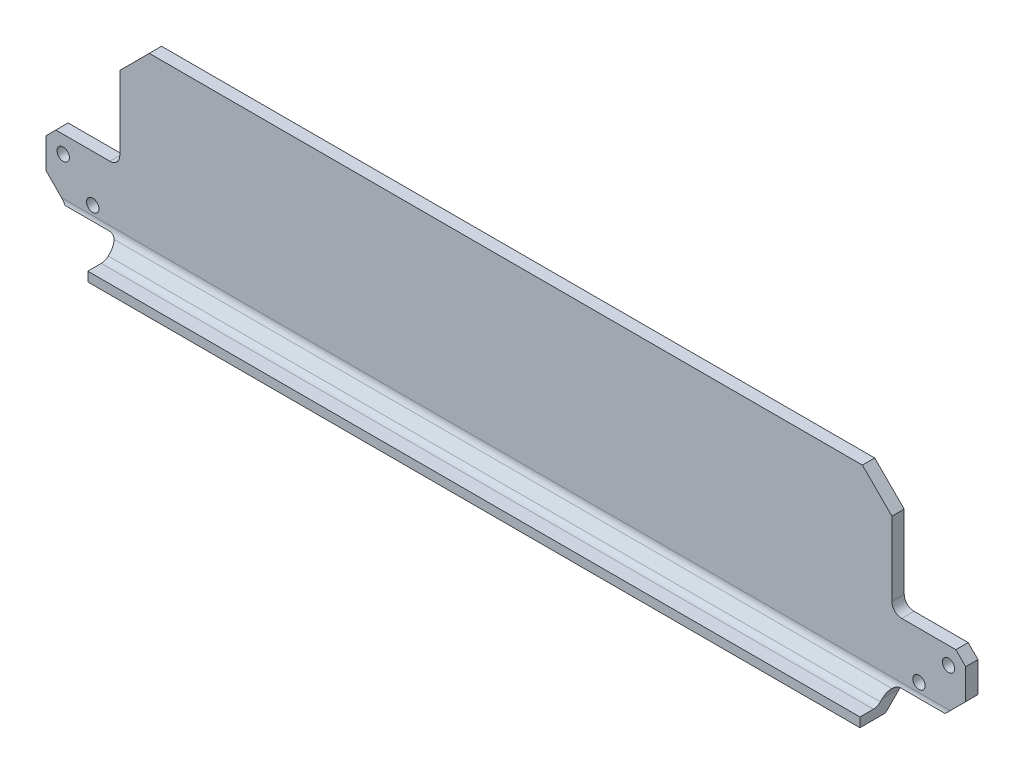
ISO-10303-21;
HEADER;
FILE_DESCRIPTION(('STEP AP214'),'2;1');
FILE_NAME('part.step','',(''),(''),'','','');
FILE_SCHEMA(('AUTOMOTIVE_DESIGN { 1 0 10303 214 1 1 1 1 }'));
ENDSEC;
DATA;
#1=APPLICATION_CONTEXT('core data for automotive mechanical design processes');
#2=APPLICATION_PROTOCOL_DEFINITION('international standard','automotive_design',2000,#1);
#3=PRODUCT_CONTEXT('',#1,'mechanical');
#4=PRODUCT('Part','Part','',(#3));
#5=PRODUCT_RELATED_PRODUCT_CATEGORY('part','',(#4));
#6=PRODUCT_DEFINITION_FORMATION('','',#4);
#7=PRODUCT_DEFINITION_CONTEXT('part definition',#1,'design');
#8=PRODUCT_DEFINITION('design','',#6,#7);
#9=PRODUCT_DEFINITION_SHAPE('','',#8);
#10=(LENGTH_UNIT() NAMED_UNIT(*) SI_UNIT(.MILLI.,.METRE.));
#11=(NAMED_UNIT(*) PLANE_ANGLE_UNIT() SI_UNIT($,.RADIAN.));
#12=(NAMED_UNIT(*) SI_UNIT($,.STERADIAN.) SOLID_ANGLE_UNIT());
#13=UNCERTAINTY_MEASURE_WITH_UNIT(LENGTH_MEASURE(1.E-05),#10,'distance_accuracy_value','');
#14=(GEOMETRIC_REPRESENTATION_CONTEXT(3) GLOBAL_UNCERTAINTY_ASSIGNED_CONTEXT((#13)) GLOBAL_UNIT_ASSIGNED_CONTEXT((#10,
#11,#12)) REPRESENTATION_CONTEXT('',''));
#15=CARTESIAN_POINT('',(0.,0.,0.));
#16=DIRECTION('',(0.,0.,1.));
#17=DIRECTION('',(1.,0.,0.));
#18=AXIS2_PLACEMENT_3D('',#15,#16,#17);
#19=CARTESIAN_POINT('',(99.695,0.,0.));
#20=DIRECTION('',(1.,0.,0.));
#21=DIRECTION('',(0.,0.,-1.));
#22=AXIS2_PLACEMENT_3D('',#19,#20,#21);
#23=PLANE('',#22);
#24=DIRECTION('',(0.,-1.,0.));
#25=VECTOR('',#24,1.);
#26=CARTESIAN_POINT('',(99.695,50.8,3.17500000000001));
#27=LINE('',#26,#25);
#28=CARTESIAN_POINT('',(99.695,43.18,3.17500000000001));
#29=VERTEX_POINT('',#28);
#30=CARTESIAN_POINT('',(99.695,24.130000000049,3.17500000000001));
#31=VERTEX_POINT('',#30);
#32=EDGE_CURVE('E611',#29,#31,#27,.T.);
#33=ORIENTED_EDGE('',*,*,#32,.T.);
#34=DIRECTION('',(0.,0.,-1.));
#35=VECTOR('',#34,1.);
#36=CARTESIAN_POINT('',(99.695,24.130000000049,0.));
#37=LINE('',#36,#35);
#38=CARTESIAN_POINT('',(99.695,24.130000000049,0.));
#39=VERTEX_POINT('',#38);
#40=EDGE_CURVE('E368',#31,#39,#37,.T.);
#41=ORIENTED_EDGE('',*,*,#40,.T.);
#42=DIRECTION('',(0.,1.,0.));
#43=VECTOR('',#42,1.);
#44=CARTESIAN_POINT('',(99.695,4.826,0.));
#45=LINE('',#44,#43);
#46=CARTESIAN_POINT('',(99.695,43.18,0.));
#47=VERTEX_POINT('',#46);
#48=EDGE_CURVE('E566',#39,#47,#45,.T.);
#49=ORIENTED_EDGE('',*,*,#48,.T.);
#50=DIRECTION('',(0.,0.,1.));
#51=VECTOR('',#50,1.);
#52=CARTESIAN_POINT('',(99.695,43.18,3.17500000000001));
#53=LINE('',#52,#51);
#54=EDGE_CURVE('E328',#47,#29,#53,.T.);
#55=ORIENTED_EDGE('',*,*,#54,.T.);
#56=EDGE_LOOP('',(#33,#41,#49,#55));
#57=FACE_BOUND('',#56,.T.);
#58=ADVANCED_FACE('F47',(#57),#23,.T.);
#59=CARTESIAN_POINT('',(-99.695,0.,0.));
#60=DIRECTION('',(1.,0.,0.));
#61=DIRECTION('',(0.,0.,-1.));
#62=AXIS2_PLACEMENT_3D('',#59,#60,#61);
#63=PLANE('',#62);
#64=DIRECTION('',(0.,1.,0.));
#65=VECTOR('',#64,1.);
#66=CARTESIAN_POINT('',(-99.695,4.826,0.));
#67=LINE('',#66,#65);
#68=CARTESIAN_POINT('',(-99.695,24.130000000049,0.));
#69=VERTEX_POINT('',#68);
#70=CARTESIAN_POINT('',(-99.695,43.18,0.));
#71=VERTEX_POINT('',#70);
#72=EDGE_CURVE('E592',#69,#71,#67,.T.);
#73=ORIENTED_EDGE('',*,*,#72,.F.);
#74=DIRECTION('',(0.,0.,-1.));
#75=VECTOR('',#74,1.);
#76=CARTESIAN_POINT('',(-99.695,24.130000000049,3.17500000000001));
#77=LINE('',#76,#75);
#78=CARTESIAN_POINT('',(-99.695,24.130000000049,3.17500000000001));
#79=VERTEX_POINT('',#78);
#80=EDGE_CURVE('E379',#69,#79,#77,.F.);
#81=ORIENTED_EDGE('',*,*,#80,.T.);
#82=DIRECTION('',(0.,-1.,0.));
#83=VECTOR('',#82,1.);
#84=CARTESIAN_POINT('',(-99.695,50.8,3.17500000000001));
#85=LINE('',#84,#83);
#86=CARTESIAN_POINT('',(-99.695,43.18,3.17500000000001));
#87=VERTEX_POINT('',#86);
#88=EDGE_CURVE('E588',#87,#79,#85,.T.);
#89=ORIENTED_EDGE('',*,*,#88,.F.);
#90=DIRECTION('',(0.,0.,-1.));
#91=VECTOR('',#90,1.);
#92=CARTESIAN_POINT('',(-99.695,43.18,0.));
#93=LINE('',#92,#91);
#94=EDGE_CURVE('E352',#87,#71,#93,.T.);
#95=ORIENTED_EDGE('',*,*,#94,.T.);
#96=EDGE_LOOP('',(#73,#81,#89,#95));
#97=FACE_BOUND('',#96,.T.);
#98=ADVANCED_FACE('F474',(#97),#63,.F.);
#99=CARTESIAN_POINT('',(99.695,2.413,11.43));
#100=DIRECTION('',(0.,0.,-1.));
#101=DIRECTION('',(-1.,0.,0.));
#102=AXIS2_PLACEMENT_3D('',#99,#100,#101);
#103=PLANE('',#102);
#104=DIRECTION('',(0.,-1.,0.));
#105=VECTOR('',#104,1.);
#106=CARTESIAN_POINT('',(-99.695,2.413,11.43));
#107=LINE('',#106,#105);
#108=CARTESIAN_POINT('',(-99.695,2.413,11.43));
#109=VERTEX_POINT('',#108);
#110=CARTESIAN_POINT('',(-99.695,0.,11.43));
#111=VERTEX_POINT('',#110);
#112=EDGE_CURVE('E266',#109,#111,#107,.T.);
#113=ORIENTED_EDGE('',*,*,#112,.T.);
#114=DIRECTION('',(-1.,0.,0.));
#115=VECTOR('',#114,1.);
#116=CARTESIAN_POINT('',(99.695,0.,11.43));
#117=LINE('',#116,#115);
#118=CARTESIAN_POINT('',(99.695,0.,11.43));
#119=VERTEX_POINT('',#118);
#120=EDGE_CURVE('E243',#119,#111,#117,.T.);
#121=ORIENTED_EDGE('',*,*,#120,.F.);
#122=DIRECTION('',(0.,-1.,0.));
#123=VECTOR('',#122,1.);
#124=CARTESIAN_POINT('',(99.695,2.413,11.43));
#125=LINE('',#124,#123);
#126=CARTESIAN_POINT('',(99.695,2.413,11.43));
#127=VERTEX_POINT('',#126);
#128=EDGE_CURVE('E252',#127,#119,#125,.T.);
#129=ORIENTED_EDGE('',*,*,#128,.F.);
#130=DIRECTION('',(-1.,0.,0.));
#131=VECTOR('',#130,1.);
#132=CARTESIAN_POINT('',(99.695,2.413,11.43));
#133=LINE('',#132,#131);
#134=EDGE_CURVE('E577',#127,#109,#133,.T.);
#135=ORIENTED_EDGE('',*,*,#134,.T.);
#136=EDGE_LOOP('',(#113,#121,#129,#135));
#137=FACE_BOUND('',#136,.T.);
#138=ADVANCED_FACE('F264',(#137),#103,.F.);
#139=CARTESIAN_POINT('',(99.695,0.,11.43));
#140=DIRECTION('',(0.,1.,0.));
#141=DIRECTION('',(0.,0.,1.));
#142=AXIS2_PLACEMENT_3D('',#139,#140,#141);
#143=PLANE('',#142);
#144=DIRECTION('',(0.,0.,-1.));
#145=VECTOR('',#144,1.);
#146=CARTESIAN_POINT('',(-99.695,0.,11.43));
#147=LINE('',#146,#145);
#148=CARTESIAN_POINT('',(-99.695,0.,4.82600000000001));
#149=VERTEX_POINT('',#148);
#150=EDGE_CURVE('E599',#111,#149,#147,.T.);
#151=ORIENTED_EDGE('',*,*,#150,.T.);
#152=DIRECTION('',(-1.,0.,0.));
#153=VECTOR('',#152,1.);
#154=CARTESIAN_POINT('',(99.695,0.,4.82600000000001));
#155=LINE('',#154,#153);
#156=CARTESIAN_POINT('',(99.695,0.,4.82600000000001));
#157=VERTEX_POINT('',#156);
#158=EDGE_CURVE('E246',#157,#149,#155,.T.);
#159=ORIENTED_EDGE('',*,*,#158,.F.);
#160=DIRECTION('',(0.,0.,-1.));
#161=VECTOR('',#160,1.);
#162=CARTESIAN_POINT('',(99.695,0.,11.43));
#163=LINE('',#162,#161);
#164=EDGE_CURVE('E239',#119,#157,#163,.T.);
#165=ORIENTED_EDGE('',*,*,#164,.F.);
#166=ORIENTED_EDGE('',*,*,#120,.T.);
#167=EDGE_LOOP('',(#151,#159,#165,#166));
#168=FACE_BOUND('',#167,.T.);
#169=ADVANCED_FACE('F241',(#168),#143,.F.);
#170=CARTESIAN_POINT('',(99.695,0.,4.82600000000001));
#171=DIRECTION('',(0.,0.707106781186549,0.707106781186546));
#172=DIRECTION('',(0.,-0.707106781186546,0.707106781186549));
#173=AXIS2_PLACEMENT_3D('',#170,#171,#172);
#174=PLANE('',#173);
#175=DIRECTION('',(0.,0.707106781186546,-0.707106781186549));
#176=VECTOR('',#175,1.);
#177=CARTESIAN_POINT('',(-99.695,0.,4.82600000000001));
#178=LINE('',#177,#176);
#179=CARTESIAN_POINT('',(-99.695,3.60112806053457,1.22487193946543));
#180=VERTEX_POINT('',#179);
#181=EDGE_CURVE('E595',#149,#180,#178,.T.);
#182=ORIENTED_EDGE('',*,*,#181,.T.);
#183=CARTESIAN_POINT('',(-102.235,3.60112806053457,1.22487193946543));
#184=DIRECTION('',(0.,0.707106781186549,0.707106781186546));
#185=DIRECTION('',(0.,-0.707106781186546,0.707106781186549));
#186=AXIS2_PLACEMENT_3D('',#183,#184,#185);
#187=ELLIPSE('',#186,3.59210244842767,2.54);
#188=CARTESIAN_POINT('',(-100.009850851761,4.826,0.));
#189=VERTEX_POINT('',#188);
#190=EDGE_CURVE('E382',#180,#189,#187,.T.);
#191=ORIENTED_EDGE('',*,*,#190,.T.);
#192=DIRECTION('',(-1.,0.,0.));
#193=VECTOR('',#192,1.);
#194=CARTESIAN_POINT('',(99.695,4.826,0.));
#195=LINE('',#194,#193);
#196=CARTESIAN_POINT('',(100.009850851761,4.826,0.));
#197=VERTEX_POINT('',#196);
#198=EDGE_CURVE('E275',#197,#189,#195,.T.);
#199=ORIENTED_EDGE('',*,*,#198,.F.);
#200=CARTESIAN_POINT('',(102.235,3.60112806053457,1.22487193946543));
#201=DIRECTION('',(0.,0.707106781186549,0.707106781186546));
#202=DIRECTION('',(0.,-0.707106781186546,0.707106781186549));
#203=AXIS2_PLACEMENT_3D('',#200,#201,#202);
#204=ELLIPSE('',#203,3.59210244842767,2.54);
#205=CARTESIAN_POINT('',(99.695,3.60112806053457,1.22487193946543));
#206=VERTEX_POINT('',#205);
#207=EDGE_CURVE('E396',#197,#206,#204,.T.);
#208=ORIENTED_EDGE('',*,*,#207,.T.);
#209=DIRECTION('',(0.,0.707106781186546,-0.707106781186549));
#210=VECTOR('',#209,1.);
#211=CARTESIAN_POINT('',(99.695,0.,4.82600000000001));
#212=LINE('',#211,#210);
#213=EDGE_CURVE('E251',#157,#206,#212,.T.);
#214=ORIENTED_EDGE('',*,*,#213,.F.);
#215=ORIENTED_EDGE('',*,*,#158,.T.);
#216=EDGE_LOOP('',(#182,#191,#199,#208,#214,#215));
#217=FACE_BOUND('',#216,.T.);
#218=ADVANCED_FACE('F514',(#217),#174,.F.);
#219=CARTESIAN_POINT('',(99.695,4.826,0.));
#220=DIRECTION('',(0.,0.,1.));
#221=DIRECTION('',(0.,-1.,0.));
#222=AXIS2_PLACEMENT_3D('',#219,#220,#221);
#223=PLANE('',#222);
#224=DIRECTION('',(-1.,0.,0.));
#225=VECTOR('',#224,1.);
#226=CARTESIAN_POINT('',(99.695,50.8,0.));
#227=LINE('',#226,#225);
#228=CARTESIAN_POINT('',(92.0749999999999,50.8,0.));
#229=VERTEX_POINT('',#228);
#230=CARTESIAN_POINT('',(-92.075,50.8,0.));
#231=VERTEX_POINT('',#230);
#232=EDGE_CURVE('E568',#229,#231,#227,.T.);
#233=ORIENTED_EDGE('',*,*,#232,.F.);
#234=DIRECTION('',(0.707106781186549,-0.707106781186546,0.));
#235=VECTOR('',#234,1.);
#236=CARTESIAN_POINT('',(99.695,43.18,0.));
#237=LINE('',#236,#235);
#238=EDGE_CURVE('E348',#229,#47,#237,.T.);
#239=ORIENTED_EDGE('',*,*,#238,.T.);
#240=ORIENTED_EDGE('',*,*,#48,.F.);
#241=CARTESIAN_POINT('',(102.235,24.130000000049,0.));
#242=DIRECTION('',(0.,0.,1.));
#243=DIRECTION('',(0.,-1.,0.));
#244=AXIS2_PLACEMENT_3D('',#241,#242,#243);
#245=CIRCLE('',#244,2.54);
#246=CARTESIAN_POINT('',(102.235,21.590000000049,0.));
#247=VERTEX_POINT('',#246);
#248=EDGE_CURVE('E403',#39,#247,#245,.T.);
#249=ORIENTED_EDGE('',*,*,#248,.T.);
#250=DIRECTION('',(1.,0.,0.));
#251=VECTOR('',#250,1.);
#252=CARTESIAN_POINT('',(99.695,21.590000000049,0.));
#253=LINE('',#252,#251);
#254=CARTESIAN_POINT('',(116.205,21.590000000049,0.));
#255=VERTEX_POINT('',#254);
#256=EDGE_CURVE('E657',#247,#255,#253,.T.);
#257=ORIENTED_EDGE('',*,*,#256,.T.);
#258=DIRECTION('',(-0.707106781186548,0.707106781186548,0.));
#259=VECTOR('',#258,1.);
#260=CARTESIAN_POINT('',(116.205,21.590000000049,0.));
#261=LINE('',#260,#259);
#262=CARTESIAN_POINT('',(118.745,19.0500000000489,0.));
#263=VERTEX_POINT('',#262);
#264=EDGE_CURVE('E309',#255,#263,#261,.F.);
#265=ORIENTED_EDGE('',*,*,#264,.T.);
#266=DIRECTION('',(0.,-1.,0.));
#267=VECTOR('',#266,1.);
#268=CARTESIAN_POINT('',(118.745,21.590000000049,0.));
#269=LINE('',#268,#267);
#270=CARTESIAN_POINT('',(118.745,11.2211280605346,0.));
#271=VERTEX_POINT('',#270);
#272=EDGE_CURVE('E661',#263,#271,#269,.T.);
#273=ORIENTED_EDGE('',*,*,#272,.T.);
#274=DIRECTION('',(0.707106781186548,0.707106781186548,0.));
#275=VECTOR('',#274,1.);
#276=CARTESIAN_POINT('',(118.745,11.2211280605346,0.));
#277=LINE('',#276,#275);
#278=CARTESIAN_POINT('',(113.665,6.14112806053457,0.));
#279=VERTEX_POINT('',#278);
#280=EDGE_CURVE('E282',#271,#279,#277,.F.);
#281=ORIENTED_EDGE('',*,*,#280,.T.);
#282=DIRECTION('',(-1.,0.,0.));
#283=VECTOR('',#282,1.);
#284=CARTESIAN_POINT('',(118.745,6.14112806053457,0.));
#285=LINE('',#284,#283);
#286=CARTESIAN_POINT('',(102.235,6.14112806053457,0.));
#287=VERTEX_POINT('',#286);
#288=EDGE_CURVE('E664',#279,#287,#285,.T.);
#289=ORIENTED_EDGE('',*,*,#288,.T.);
#290=CARTESIAN_POINT('',(102.235,3.60112806053457,0.));
#291=DIRECTION('',(0.,0.,1.));
#292=DIRECTION('',(0.,-1.,0.));
#293=AXIS2_PLACEMENT_3D('',#290,#291,#292);
#294=CIRCLE('',#293,2.54);
#295=EDGE_CURVE('E392',#287,#197,#294,.T.);
#296=ORIENTED_EDGE('',*,*,#295,.T.);
#297=ORIENTED_EDGE('',*,*,#198,.T.);
#298=CARTESIAN_POINT('',(-102.235,3.60112806053457,0.));
#299=DIRECTION('',(0.,0.,1.));
#300=DIRECTION('',(0.,-1.,0.));
#301=AXIS2_PLACEMENT_3D('',#298,#299,#300);
#302=CIRCLE('',#301,2.54);
#303=CARTESIAN_POINT('',(-102.235,6.14112806053457,0.));
#304=VERTEX_POINT('',#303);
#305=EDGE_CURVE('E386',#189,#304,#302,.T.);
#306=ORIENTED_EDGE('',*,*,#305,.T.);
#307=DIRECTION('',(1.,0.,0.));
#308=VECTOR('',#307,1.);
#309=CARTESIAN_POINT('',(-118.745,6.14112806053457,0.));
#310=LINE('',#309,#308);
#311=CARTESIAN_POINT('',(-113.665,6.14112806053457,0.));
#312=VERTEX_POINT('',#311);
#313=EDGE_CURVE('E622',#312,#304,#310,.T.);
#314=ORIENTED_EDGE('',*,*,#313,.F.);
#315=DIRECTION('',(0.707106781186546,-0.707106781186549,0.));
#316=VECTOR('',#315,1.);
#317=CARTESIAN_POINT('',(-113.665,6.14112806053457,0.));
#318=LINE('',#317,#316);
#319=CARTESIAN_POINT('',(-118.745,11.2211280605346,0.));
#320=VERTEX_POINT('',#319);
#321=EDGE_CURVE('E273',#312,#320,#318,.F.);
#322=ORIENTED_EDGE('',*,*,#321,.T.);
#323=DIRECTION('',(0.,-1.,0.));
#324=VECTOR('',#323,1.);
#325=CARTESIAN_POINT('',(-118.745,21.590000000049,0.));
#326=LINE('',#325,#324);
#327=CARTESIAN_POINT('',(-118.745,19.050000000049,0.));
#328=VERTEX_POINT('',#327);
#329=EDGE_CURVE('E630',#328,#320,#326,.T.);
#330=ORIENTED_EDGE('',*,*,#329,.F.);
#331=DIRECTION('',(-0.707106781186551,-0.707106781186544,0.));
#332=VECTOR('',#331,1.);
#333=CARTESIAN_POINT('',(-118.745,19.050000000049,0.));
#334=LINE('',#333,#332);
#335=CARTESIAN_POINT('',(-116.205,21.590000000049,0.));
#336=VERTEX_POINT('',#335);
#337=EDGE_CURVE('E305',#328,#336,#334,.F.);
#338=ORIENTED_EDGE('',*,*,#337,.T.);
#339=DIRECTION('',(-1.,0.,0.));
#340=VECTOR('',#339,1.);
#341=CARTESIAN_POINT('',(-99.695,21.590000000049,0.));
#342=LINE('',#341,#340);
#343=CARTESIAN_POINT('',(-102.235,21.590000000049,0.));
#344=VERTEX_POINT('',#343);
#345=EDGE_CURVE('E631',#344,#336,#342,.T.);
#346=ORIENTED_EDGE('',*,*,#345,.F.);
#347=CARTESIAN_POINT('',(-102.235,24.130000000049,0.));
#348=DIRECTION('',(0.,0.,1.));
#349=DIRECTION('',(0.,-1.,0.));
#350=AXIS2_PLACEMENT_3D('',#347,#348,#349);
#351=CIRCLE('',#350,2.54);
#352=EDGE_CURVE('E409',#344,#69,#351,.T.);
#353=ORIENTED_EDGE('',*,*,#352,.T.);
#354=ORIENTED_EDGE('',*,*,#72,.T.);
#355=DIRECTION('',(-0.707106781186546,-0.707106781186549,0.));
#356=VECTOR('',#355,1.);
#357=CARTESIAN_POINT('',(-92.075,50.8,0.));
#358=LINE('',#357,#356);
#359=EDGE_CURVE('E345',#71,#231,#358,.F.);
#360=ORIENTED_EDGE('',*,*,#359,.T.);
#361=EDGE_LOOP('',(#233,#239,#240,#249,#257,#265,#273,#281,#289,#296,#297,#306,#314,#322,#330,
#338,#346,#353,#354,#360));
#362=FACE_BOUND('',#361,.T.);
#363=CARTESIAN_POINT('',(-114.3,17.145,0.));
#364=DIRECTION('',(0.,0.,1.));
#365=DIRECTION('',(1.,0.,0.));
#366=AXIS2_PLACEMENT_3D('',#363,#364,#365);
#367=CIRCLE('',#366,1.6002);
#368=CARTESIAN_POINT('',(-112.6998,17.145,0.));
#369=VERTEX_POINT('',#368);
#370=EDGE_CURVE('E640',#369,#369,#367,.T.);
#371=ORIENTED_EDGE('',*,*,#370,.T.);
#372=EDGE_LOOP('',(#371));
#373=FACE_BOUND('',#372,.T.);
#374=CARTESIAN_POINT('',(-106.68,9.525,0.));
#375=DIRECTION('',(0.,0.,1.));
#376=DIRECTION('',(1.,0.,0.));
#377=AXIS2_PLACEMENT_3D('',#374,#375,#376);
#378=CIRCLE('',#377,1.6002);
#379=CARTESIAN_POINT('',(-105.0798,9.525,0.));
#380=VERTEX_POINT('',#379);
#381=EDGE_CURVE('E636',#380,#380,#378,.T.);
#382=ORIENTED_EDGE('',*,*,#381,.T.);
#383=EDGE_LOOP('',(#382));
#384=FACE_BOUND('',#383,.T.);
#385=CARTESIAN_POINT('',(106.68,9.525,0.));
#386=DIRECTION('',(0.,0.,-1.));
#387=DIRECTION('',(-1.,0.,0.));
#388=AXIS2_PLACEMENT_3D('',#385,#386,#387);
#389=CIRCLE('',#388,1.6002);
#390=CARTESIAN_POINT('',(105.0798,9.525,0.));
#391=VERTEX_POINT('',#390);
#392=EDGE_CURVE('E672',#391,#391,#389,.T.);
#393=ORIENTED_EDGE('',*,*,#392,.F.);
#394=EDGE_LOOP('',(#393));
#395=FACE_BOUND('',#394,.T.);
#396=CARTESIAN_POINT('',(114.3,17.145,0.));
#397=DIRECTION('',(0.,0.,-1.));
#398=DIRECTION('',(-1.,0.,0.));
#399=AXIS2_PLACEMENT_3D('',#396,#397,#398);
#400=CIRCLE('',#399,1.6002);
#401=CARTESIAN_POINT('',(112.6998,17.145,0.));
#402=VERTEX_POINT('',#401);
#403=EDGE_CURVE('E668',#402,#402,#400,.T.);
#404=ORIENTED_EDGE('',*,*,#403,.F.);
#405=EDGE_LOOP('',(#404));
#406=FACE_BOUND('',#405,.T.);
#407=ADVANCED_FACE('F510',(#362,#373,#384,#395,#406),#223,.F.);
#408=CARTESIAN_POINT('',(99.695,50.8,0.));
#409=DIRECTION('',(0.,-1.,0.));
#410=DIRECTION('',(0.,0.,-1.));
#411=AXIS2_PLACEMENT_3D('',#408,#409,#410);
#412=PLANE('',#411);
#413=DIRECTION('',(-1.,0.,0.));
#414=VECTOR('',#413,1.);
#415=CARTESIAN_POINT('',(99.695,50.8,3.17500000000001));
#416=LINE('',#415,#414);
#417=CARTESIAN_POINT('',(92.0749999999999,50.8,3.17500000000001));
#418=VERTEX_POINT('',#417);
#419=CARTESIAN_POINT('',(-92.075,50.8,3.17500000000001));
#420=VERTEX_POINT('',#419);
#421=EDGE_CURVE('E572',#418,#420,#416,.T.);
#422=ORIENTED_EDGE('',*,*,#421,.F.);
#423=DIRECTION('',(0.,0.,-1.));
#424=VECTOR('',#423,1.);
#425=CARTESIAN_POINT('',(92.0749999999999,50.8,0.));
#426=LINE('',#425,#424);
#427=EDGE_CURVE('E342',#418,#229,#426,.T.);
#428=ORIENTED_EDGE('',*,*,#427,.T.);
#429=ORIENTED_EDGE('',*,*,#232,.T.);
#430=DIRECTION('',(0.,0.,1.));
#431=VECTOR('',#430,1.);
#432=CARTESIAN_POINT('',(-92.075,50.8,0.));
#433=LINE('',#432,#431);
#434=EDGE_CURVE('E338',#231,#420,#433,.T.);
#435=ORIENTED_EDGE('',*,*,#434,.T.);
#436=EDGE_LOOP('',(#422,#428,#429,#435));
#437=FACE_BOUND('',#436,.T.);
#438=ADVANCED_FACE('F506',(#437),#412,.F.);
#439=CARTESIAN_POINT('',(99.695,50.8,3.17500000000001));
#440=DIRECTION('',(0.,0.,-1.));
#441=DIRECTION('',(0.,1.,0.));
#442=AXIS2_PLACEMENT_3D('',#439,#440,#441);
#443=PLANE('',#442);
#444=DIRECTION('',(-0.707106781186546,0.707106781186549,0.));
#445=VECTOR('',#444,1.);
#446=CARTESIAN_POINT('',(-113.665,6.14112806053457,3.175));
#447=LINE('',#446,#445);
#448=CARTESIAN_POINT('',(-118.745,11.2211280605346,3.17500000000001));
#449=VERTEX_POINT('',#448);
#450=CARTESIAN_POINT('',(-114.717102448428,7.19323050896224,3.175));
#451=VERTEX_POINT('',#450);
#452=EDGE_CURVE('E287',#449,#451,#447,.F.);
#453=ORIENTED_EDGE('',*,*,#452,.T.);
#454=DIRECTION('',(-1.,0.,0.));
#455=VECTOR('',#454,1.);
#456=CARTESIAN_POINT('',(102.235,7.19323050896224,3.17500000000001));
#457=LINE('',#456,#455);
#458=CARTESIAN_POINT('',(114.717102448428,7.19323050896223,3.17500000000001));
#459=VERTEX_POINT('',#458);
#460=EDGE_CURVE('E426',#451,#459,#457,.F.);
#461=ORIENTED_EDGE('',*,*,#460,.T.);
#462=DIRECTION('',(-0.707106781186548,-0.707106781186548,0.));
#463=VECTOR('',#462,1.);
#464=CARTESIAN_POINT('',(118.745,11.2211280605346,3.17500000000001));
#465=LINE('',#464,#463);
#466=CARTESIAN_POINT('',(118.745,11.2211280605346,3.17500000000001));
#467=VERTEX_POINT('',#466);
#468=EDGE_CURVE('E291',#459,#467,#465,.F.);
#469=ORIENTED_EDGE('',*,*,#468,.T.);
#470=DIRECTION('',(0.,1.,0.));
#471=VECTOR('',#470,1.);
#472=CARTESIAN_POINT('',(118.745,21.590000000049,3.17500000000001));
#473=LINE('',#472,#471);
#474=CARTESIAN_POINT('',(118.745,19.0500000000489,3.17500000000001));
#475=VERTEX_POINT('',#474);
#476=EDGE_CURVE('E660',#467,#475,#473,.T.);
#477=ORIENTED_EDGE('',*,*,#476,.T.);
#478=DIRECTION('',(0.707106781186548,-0.707106781186548,0.));
#479=VECTOR('',#478,1.);
#480=CARTESIAN_POINT('',(116.205,21.590000000049,3.17500000000001));
#481=LINE('',#480,#479);
#482=CARTESIAN_POINT('',(116.205,21.590000000049,3.17500000000001));
#483=VERTEX_POINT('',#482);
#484=EDGE_CURVE('E318',#475,#483,#481,.F.);
#485=ORIENTED_EDGE('',*,*,#484,.T.);
#486=DIRECTION('',(-1.,0.,0.));
#487=VECTOR('',#486,1.);
#488=CARTESIAN_POINT('',(99.695,21.590000000049,3.17500000000001));
#489=LINE('',#488,#487);
#490=CARTESIAN_POINT('',(102.235,21.590000000049,3.17500000000001));
#491=VERTEX_POINT('',#490);
#492=EDGE_CURVE('E656',#483,#491,#489,.T.);
#493=ORIENTED_EDGE('',*,*,#492,.T.);
#494=CARTESIAN_POINT('',(102.235,24.130000000049,3.17500000000001));
#495=DIRECTION('',(0.,0.,-1.));
#496=DIRECTION('',(0.,1.,0.));
#497=AXIS2_PLACEMENT_3D('',#494,#495,#496);
#498=CIRCLE('',#497,2.54);
#499=EDGE_CURVE('E406',#491,#31,#498,.T.);
#500=ORIENTED_EDGE('',*,*,#499,.T.);
#501=ORIENTED_EDGE('',*,*,#32,.F.);
#502=DIRECTION('',(-0.707106781186549,0.707106781186546,0.));
#503=VECTOR('',#502,1.);
#504=CARTESIAN_POINT('',(99.695,43.18,3.17500000000001));
#505=LINE('',#504,#503);
#506=EDGE_CURVE('E335',#29,#418,#505,.T.);
#507=ORIENTED_EDGE('',*,*,#506,.T.);
#508=ORIENTED_EDGE('',*,*,#421,.T.);
#509=DIRECTION('',(0.707106781186546,0.707106781186549,0.));
#510=VECTOR('',#509,1.);
#511=CARTESIAN_POINT('',(-92.075,50.8,3.17500000000001));
#512=LINE('',#511,#510);
#513=EDGE_CURVE('E332',#420,#87,#512,.F.);
#514=ORIENTED_EDGE('',*,*,#513,.T.);
#515=ORIENTED_EDGE('',*,*,#88,.T.);
#516=CARTESIAN_POINT('',(-102.235,24.130000000049,3.17500000000001));
#517=DIRECTION('',(0.,0.,-1.));
#518=DIRECTION('',(0.,1.,0.));
#519=AXIS2_PLACEMENT_3D('',#516,#517,#518);
#520=CIRCLE('',#519,2.54);
#521=CARTESIAN_POINT('',(-102.235,21.590000000049,3.17500000000001));
#522=VERTEX_POINT('',#521);
#523=EDGE_CURVE('E412',#79,#522,#520,.T.);
#524=ORIENTED_EDGE('',*,*,#523,.T.);
#525=DIRECTION('',(1.,0.,0.));
#526=VECTOR('',#525,1.);
#527=CARTESIAN_POINT('',(-99.695,21.590000000049,3.17500000000001));
#528=LINE('',#527,#526);
#529=CARTESIAN_POINT('',(-116.205,21.590000000049,3.17500000000001));
#530=VERTEX_POINT('',#529);
#531=EDGE_CURVE('E632',#530,#522,#528,.T.);
#532=ORIENTED_EDGE('',*,*,#531,.F.);
#533=DIRECTION('',(0.707106781186551,0.707106781186544,0.));
#534=VECTOR('',#533,1.);
#535=CARTESIAN_POINT('',(-118.745,19.050000000049,3.17500000000001));
#536=LINE('',#535,#534);
#537=CARTESIAN_POINT('',(-118.745,19.050000000049,3.17500000000001));
#538=VERTEX_POINT('',#537);
#539=EDGE_CURVE('E315',#530,#538,#536,.F.);
#540=ORIENTED_EDGE('',*,*,#539,.T.);
#541=DIRECTION('',(0.,1.,0.));
#542=VECTOR('',#541,1.);
#543=CARTESIAN_POINT('',(-118.745,21.590000000049,3.17500000000001));
#544=LINE('',#543,#542);
#545=EDGE_CURVE('E626',#449,#538,#544,.T.);
#546=ORIENTED_EDGE('',*,*,#545,.F.);
#547=EDGE_LOOP('',(#453,#461,#469,#477,#485,#493,#500,#501,#507,#508,#514,#515,#524,#532,#540,#546));
#548=FACE_BOUND('',#547,.T.);
#549=CARTESIAN_POINT('',(-106.68,9.525,3.17500000000001));
#550=DIRECTION('',(0.,0.,-1.));
#551=DIRECTION('',(0.,1.,0.));
#552=AXIS2_PLACEMENT_3D('',#549,#550,#551);
#553=CIRCLE('',#552,1.6002);
#554=CARTESIAN_POINT('',(-106.68,11.1252,3.17500000000001));
#555=VERTEX_POINT('',#554);
#556=EDGE_CURVE('E618',#555,#555,#553,.T.);
#557=ORIENTED_EDGE('',*,*,#556,.T.);
#558=EDGE_LOOP('',(#557));
#559=FACE_BOUND('',#558,.T.);
#560=CARTESIAN_POINT('',(-114.3,17.145,3.17500000000001));
#561=DIRECTION('',(0.,0.,-1.));
#562=DIRECTION('',(0.,1.,0.));
#563=AXIS2_PLACEMENT_3D('',#560,#561,#562);
#564=CIRCLE('',#563,1.6002);
#565=CARTESIAN_POINT('',(-114.3,18.7452,3.17500000000001));
#566=VERTEX_POINT('',#565);
#567=EDGE_CURVE('E604',#566,#566,#564,.T.);
#568=ORIENTED_EDGE('',*,*,#567,.T.);
#569=EDGE_LOOP('',(#568));
#570=FACE_BOUND('',#569,.T.);
#571=CARTESIAN_POINT('',(106.68,9.525,3.17500000000001));
#572=DIRECTION('',(0.,0.,-1.));
#573=DIRECTION('',(0.,1.,0.));
#574=AXIS2_PLACEMENT_3D('',#571,#572,#573);
#575=CIRCLE('',#574,1.6002);
#576=CARTESIAN_POINT('',(106.68,11.1252,3.17500000000001));
#577=VERTEX_POINT('',#576);
#578=EDGE_CURVE('E652',#577,#577,#575,.F.);
#579=ORIENTED_EDGE('',*,*,#578,.F.);
#580=EDGE_LOOP('',(#579));
#581=FACE_BOUND('',#580,.T.);
#582=CARTESIAN_POINT('',(114.3,17.145,3.17500000000001));
#583=DIRECTION('',(0.,0.,-1.));
#584=DIRECTION('',(0.,1.,0.));
#585=AXIS2_PLACEMENT_3D('',#582,#583,#584);
#586=CIRCLE('',#585,1.6002);
#587=CARTESIAN_POINT('',(114.3,18.7452,3.17500000000001));
#588=VERTEX_POINT('',#587);
#589=EDGE_CURVE('E644',#588,#588,#586,.F.);
#590=ORIENTED_EDGE('',*,*,#589,.F.);
#591=EDGE_LOOP('',(#590));
#592=FACE_BOUND('',#591,.T.);
#593=ADVANCED_FACE('F500',(#548,#559,#570,#581,#592),#443,.F.);
#594=CARTESIAN_POINT('',(99.695,6.14112806053457,3.17500000000001));
#595=DIRECTION('',(0.,-0.707106781186549,-0.707106781186546));
#596=DIRECTION('',(0.,0.707106781186546,-0.707106781186549));
#597=AXIS2_PLACEMENT_3D('',#594,#595,#596);
#598=PLANE('',#597);
#599=DIRECTION('',(0.,-0.707106781186546,0.707106781186549));
#600=VECTOR('',#599,1.);
#601=CARTESIAN_POINT('',(-99.695,6.14112806053457,3.17500000000001));
#602=LINE('',#601,#600);
#603=CARTESIAN_POINT('',(-99.695,3.60112806053457,5.71500000000001));
#604=VERTEX_POINT('',#603);
#605=CARTESIAN_POINT('',(-99.695,3.15694877578617,6.15917928474842));
#606=VERTEX_POINT('',#605);
#607=EDGE_CURVE('E584',#604,#606,#602,.T.);
#608=ORIENTED_EDGE('',*,*,#607,.T.);
#609=DIRECTION('',(-1.,0.,0.));
#610=VECTOR('',#609,1.);
#611=CARTESIAN_POINT('',(99.695,3.15694877578617,6.15917928474842));
#612=LINE('',#611,#610);
#613=CARTESIAN_POINT('',(99.695,3.15694877578617,6.15917928474842));
#614=VERTEX_POINT('',#613);
#615=EDGE_CURVE('E423',#606,#614,#612,.F.);
#616=ORIENTED_EDGE('',*,*,#615,.T.);
#617=DIRECTION('',(0.,-0.707106781186546,0.707106781186549));
#618=VECTOR('',#617,1.);
#619=CARTESIAN_POINT('',(99.695,6.14112806053457,3.17500000000001));
#620=LINE('',#619,#618);
#621=CARTESIAN_POINT('',(99.695,3.60112806053457,5.71500000000001));
#622=VERTEX_POINT('',#621);
#623=EDGE_CURVE('E607',#622,#614,#620,.T.);
#624=ORIENTED_EDGE('',*,*,#623,.F.);
#625=CARTESIAN_POINT('',(102.235,3.60112806053457,5.71500000000001));
#626=DIRECTION('',(0.,-0.707106781186549,-0.707106781186546));
#627=DIRECTION('',(0.,-0.707106781186546,0.707106781186549));
#628=AXIS2_PLACEMENT_3D('',#625,#626,#627);
#629=ELLIPSE('',#628,3.59210244842767,2.54);
#630=CARTESIAN_POINT('',(100.438948775786,5.3971792847484,3.91894877578618));
#631=VERTEX_POINT('',#630);
#632=EDGE_CURVE('E399',#622,#631,#629,.T.);
#633=ORIENTED_EDGE('',*,*,#632,.T.);
#634=DIRECTION('',(-1.,0.,0.));
#635=VECTOR('',#634,1.);
#636=CARTESIAN_POINT('',(-102.235,5.3971792847484,3.91894877578618));
#637=LINE('',#636,#635);
#638=CARTESIAN_POINT('',(-100.438948775786,5.3971792847484,3.91894877578618));
#639=VERTEX_POINT('',#638);
#640=EDGE_CURVE('E419',#631,#639,#637,.T.);
#641=ORIENTED_EDGE('',*,*,#640,.T.);
#642=CARTESIAN_POINT('',(-102.235,3.60112806053457,5.71500000000001));
#643=DIRECTION('',(0.,-0.707106781186549,-0.707106781186546));
#644=DIRECTION('',(0.,-0.707106781186546,0.707106781186549));
#645=AXIS2_PLACEMENT_3D('',#642,#643,#644);
#646=ELLIPSE('',#645,3.59210244842767,2.54);
#647=EDGE_CURVE('E389',#639,#604,#646,.T.);
#648=ORIENTED_EDGE('',*,*,#647,.T.);
#649=EDGE_LOOP('',(#608,#616,#624,#633,#641,#648));
#650=FACE_BOUND('',#649,.T.);
#651=ADVANCED_FACE('F494',(#650),#598,.F.);
#652=CARTESIAN_POINT('',(99.695,2.413,6.90312806053459));
#653=DIRECTION('',(0.,-1.,0.));
#654=DIRECTION('',(0.,0.,-1.));
#655=AXIS2_PLACEMENT_3D('',#652,#653,#654);
#656=PLANE('',#655);
#657=DIRECTION('',(0.,0.,1.));
#658=VECTOR('',#657,1.);
#659=CARTESIAN_POINT('',(99.695,2.413,6.90312806053459));
#660=LINE('',#659,#658);
#661=CARTESIAN_POINT('',(99.695,2.413,7.95523050896225));
#662=VERTEX_POINT('',#661);
#663=EDGE_CURVE('E257',#662,#127,#660,.T.);
#664=ORIENTED_EDGE('',*,*,#663,.F.);
#665=DIRECTION('',(-1.,0.,0.));
#666=VECTOR('',#665,1.);
#667=CARTESIAN_POINT('',(-99.695,2.413,7.95523050896225));
#668=LINE('',#667,#666);
#669=CARTESIAN_POINT('',(-99.695,2.413,7.95523050896225));
#670=VERTEX_POINT('',#669);
#671=EDGE_CURVE('E415',#662,#670,#668,.T.);
#672=ORIENTED_EDGE('',*,*,#671,.T.);
#673=DIRECTION('',(0.,0.,1.));
#674=VECTOR('',#673,1.);
#675=CARTESIAN_POINT('',(-99.695,2.413,6.90312806053459));
#676=LINE('',#675,#674);
#677=EDGE_CURVE('E262',#670,#109,#676,.T.);
#678=ORIENTED_EDGE('',*,*,#677,.T.);
#679=ORIENTED_EDGE('',*,*,#134,.F.);
#680=EDGE_LOOP('',(#664,#672,#678,#679));
#681=FACE_BOUND('',#680,.T.);
#682=ADVANCED_FACE('F487',(#681),#656,.F.);
#683=ORIENTED_EDGE('',*,*,#213,.T.);
#684=DIRECTION('',(0.,0.,-1.));
#685=VECTOR('',#684,1.);
#686=CARTESIAN_POINT('',(99.695,3.60112806053457,3.175));
#687=LINE('',#686,#685);
#688=EDGE_CURVE('E365',#206,#622,#687,.F.);
#689=ORIENTED_EDGE('',*,*,#688,.T.);
#690=ORIENTED_EDGE('',*,*,#623,.T.);
#691=CARTESIAN_POINT('',(99.695,4.953,7.95523050896225));
#692=DIRECTION('',(1.,0.,0.));
#693=DIRECTION('',(0.,0.,-1.));
#694=AXIS2_PLACEMENT_3D('',#691,#692,#693);
#695=CIRCLE('',#694,2.54);
#696=EDGE_CURVE('E432',#614,#662,#695,.F.);
#697=ORIENTED_EDGE('',*,*,#696,.T.);
#698=ORIENTED_EDGE('',*,*,#663,.T.);
#699=ORIENTED_EDGE('',*,*,#128,.T.);
#700=ORIENTED_EDGE('',*,*,#164,.T.);
#701=EDGE_LOOP('',(#683,#689,#690,#697,#698,#699,#700));
#702=FACE_BOUND('',#701,.T.);
#703=ADVANCED_FACE('F255',(#702),#23,.T.);
#704=ORIENTED_EDGE('',*,*,#607,.F.);
#705=DIRECTION('',(0.,0.,-1.));
#706=VECTOR('',#705,1.);
#707=CARTESIAN_POINT('',(-99.695,3.60112806053457,0.));
#708=LINE('',#707,#706);
#709=EDGE_CURVE('E356',#604,#180,#708,.T.);
#710=ORIENTED_EDGE('',*,*,#709,.T.);
#711=ORIENTED_EDGE('',*,*,#181,.F.);
#712=ORIENTED_EDGE('',*,*,#150,.F.);
#713=ORIENTED_EDGE('',*,*,#112,.F.);
#714=ORIENTED_EDGE('',*,*,#677,.F.);
#715=CARTESIAN_POINT('',(-99.695,4.953,7.95523050896225));
#716=DIRECTION('',(1.,0.,0.));
#717=DIRECTION('',(0.,0.,-1.));
#718=AXIS2_PLACEMENT_3D('',#715,#716,#717);
#719=CIRCLE('',#718,2.54);
#720=EDGE_CURVE('E429',#670,#606,#719,.T.);
#721=ORIENTED_EDGE('',*,*,#720,.T.);
#722=EDGE_LOOP('',(#704,#710,#711,#712,#713,#714,#721));
#723=FACE_BOUND('',#722,.T.);
#724=ADVANCED_FACE('F483',(#723),#63,.F.);
#725=CARTESIAN_POINT('',(-99.695,21.590000000049,27.7019269213148));
#726=DIRECTION('',(0.,-1.,0.));
#727=DIRECTION('',(1.,0.,0.));
#728=AXIS2_PLACEMENT_3D('',#725,#726,#727);
#729=PLANE('',#728);
#730=ORIENTED_EDGE('',*,*,#531,.T.);
#731=DIRECTION('',(0.,0.,-1.));
#732=VECTOR('',#731,1.);
#733=CARTESIAN_POINT('',(-102.235,21.590000000049,0.));
#734=LINE('',#733,#732);
#735=EDGE_CURVE('E375',#522,#344,#734,.T.);
#736=ORIENTED_EDGE('',*,*,#735,.T.);
#737=ORIENTED_EDGE('',*,*,#345,.T.);
#738=DIRECTION('',(0.,0.,1.));
#739=VECTOR('',#738,1.);
#740=CARTESIAN_POINT('',(-116.205,21.590000000049,27.7019269213148));
#741=LINE('',#740,#739);
#742=EDGE_CURVE('E325',#336,#530,#741,.T.);
#743=ORIENTED_EDGE('',*,*,#742,.T.);
#744=EDGE_LOOP('',(#730,#736,#737,#743));
#745=FACE_BOUND('',#744,.T.);
#746=ADVANCED_FACE('F492',(#745),#729,.F.);
#747=CARTESIAN_POINT('',(-118.745,21.590000000049,27.7019269213148));
#748=DIRECTION('',(1.,0.,0.));
#749=DIRECTION('',(0.,0.,-1.));
#750=AXIS2_PLACEMENT_3D('',#747,#748,#749);
#751=PLANE('',#750);
#752=ORIENTED_EDGE('',*,*,#545,.T.);
#753=DIRECTION('',(0.,0.,-1.));
#754=VECTOR('',#753,1.);
#755=CARTESIAN_POINT('',(-118.745,19.050000000049,27.7019269213148));
#756=LINE('',#755,#754);
#757=EDGE_CURVE('E321',#538,#328,#756,.T.);
#758=ORIENTED_EDGE('',*,*,#757,.T.);
#759=ORIENTED_EDGE('',*,*,#329,.T.);
#760=DIRECTION('',(0.,0.,1.));
#761=VECTOR('',#760,1.);
#762=CARTESIAN_POINT('',(-118.745,11.2211280605346,27.7019269213148));
#763=LINE('',#762,#761);
#764=EDGE_CURVE('E298',#320,#449,#763,.T.);
#765=ORIENTED_EDGE('',*,*,#764,.T.);
#766=EDGE_LOOP('',(#752,#758,#759,#765));
#767=FACE_BOUND('',#766,.T.);
#768=ADVANCED_FACE('F716',(#767),#751,.F.);
#769=CARTESIAN_POINT('',(-118.745,6.14112806053457,27.7019269213148));
#770=DIRECTION('',(0.,1.,0.));
#771=DIRECTION('',(0.,0.,1.));
#772=AXIS2_PLACEMENT_3D('',#769,#770,#771);
#773=PLANE('',#772);
#774=ORIENTED_EDGE('',*,*,#313,.T.);
#775=DIRECTION('',(0.,0.,-1.));
#776=VECTOR('',#775,1.);
#777=CARTESIAN_POINT('',(-102.235,6.14112806053457,3.175));
#778=LINE('',#777,#776);
#779=CARTESIAN_POINT('',(-102.235,6.14112806053457,3.40314350834389));
#780=VERTEX_POINT('',#779);
#781=EDGE_CURVE('E360',#304,#780,#778,.F.);
#782=ORIENTED_EDGE('',*,*,#781,.T.);
#783=DIRECTION('',(1.,0.,0.));
#784=VECTOR('',#783,1.);
#785=CARTESIAN_POINT('',(-102.235,6.14112806053457,3.40314350834389));
#786=LINE('',#785,#784);
#787=CARTESIAN_POINT('',(-113.665,6.14112806053457,3.40314350834389));
#788=VERTEX_POINT('',#787);
#789=EDGE_CURVE('E444',#780,#788,#786,.F.);
#790=ORIENTED_EDGE('',*,*,#789,.T.);
#791=DIRECTION('',(0.,0.,-1.));
#792=VECTOR('',#791,1.);
#793=CARTESIAN_POINT('',(-113.665,6.14112806053457,27.7019269213148));
#794=LINE('',#793,#792);
#795=EDGE_CURVE('E294',#788,#312,#794,.T.);
#796=ORIENTED_EDGE('',*,*,#795,.T.);
#797=EDGE_LOOP('',(#774,#782,#790,#796));
#798=FACE_BOUND('',#797,.T.);
#799=ADVANCED_FACE('F712',(#798),#773,.F.);
#800=CARTESIAN_POINT('',(-114.3,17.145,27.7019269213148));
#801=DIRECTION('',(0.,0.,-1.));
#802=DIRECTION('',(-1.,0.,0.));
#803=AXIS2_PLACEMENT_3D('',#800,#801,#802);
#804=CYLINDRICAL_SURFACE('',#803,1.6002);
#805=ORIENTED_EDGE('',*,*,#567,.F.);
#806=EDGE_LOOP('',(#805));
#807=FACE_BOUND('',#806,.T.);
#808=ORIENTED_EDGE('',*,*,#370,.F.);
#809=EDGE_LOOP('',(#808));
#810=FACE_BOUND('',#809,.T.);
#811=ADVANCED_FACE('F715',(#807,#810),#804,.F.);
#812=CARTESIAN_POINT('',(-106.68,9.525,27.7019269213148));
#813=DIRECTION('',(0.,0.,-1.));
#814=DIRECTION('',(-1.,0.,0.));
#815=AXIS2_PLACEMENT_3D('',#812,#813,#814);
#816=CYLINDRICAL_SURFACE('',#815,1.6002);
#817=ORIENTED_EDGE('',*,*,#556,.F.);
#818=EDGE_LOOP('',(#817));
#819=FACE_BOUND('',#818,.T.);
#820=ORIENTED_EDGE('',*,*,#381,.F.);
#821=EDGE_LOOP('',(#820));
#822=FACE_BOUND('',#821,.T.);
#823=ADVANCED_FACE('F707',(#819,#822),#816,.F.);
#824=CARTESIAN_POINT('',(99.695,21.590000000049,27.7019269213148));
#825=DIRECTION('',(0.,1.,0.));
#826=DIRECTION('',(-1.,0.,0.));
#827=AXIS2_PLACEMENT_3D('',#824,#825,#826);
#828=PLANE('',#827);
#829=ORIENTED_EDGE('',*,*,#256,.F.);
#830=DIRECTION('',(0.,0.,-1.));
#831=VECTOR('',#830,1.);
#832=CARTESIAN_POINT('',(102.235,21.590000000049,3.17500000000001));
#833=LINE('',#832,#831);
#834=EDGE_CURVE('E372',#247,#491,#833,.F.);
#835=ORIENTED_EDGE('',*,*,#834,.T.);
#836=ORIENTED_EDGE('',*,*,#492,.F.);
#837=DIRECTION('',(0.,0.,-1.));
#838=VECTOR('',#837,1.);
#839=CARTESIAN_POINT('',(116.205,21.590000000049,27.7019269213148));
#840=LINE('',#839,#838);
#841=EDGE_CURVE('E301',#483,#255,#840,.T.);
#842=ORIENTED_EDGE('',*,*,#841,.T.);
#843=EDGE_LOOP('',(#829,#835,#836,#842));
#844=FACE_BOUND('',#843,.T.);
#845=ADVANCED_FACE('F704',(#844),#828,.T.);
#846=CARTESIAN_POINT('',(118.745,21.590000000049,27.7019269213148));
#847=DIRECTION('',(1.,0.,0.));
#848=DIRECTION('',(0.,0.,-1.));
#849=AXIS2_PLACEMENT_3D('',#846,#847,#848);
#850=PLANE('',#849);
#851=ORIENTED_EDGE('',*,*,#272,.F.);
#852=DIRECTION('',(0.,0.,1.));
#853=VECTOR('',#852,1.);
#854=CARTESIAN_POINT('',(118.745,19.0500000000489,27.7019269213148));
#855=LINE('',#854,#853);
#856=EDGE_CURVE('E312',#263,#475,#855,.T.);
#857=ORIENTED_EDGE('',*,*,#856,.T.);
#858=ORIENTED_EDGE('',*,*,#476,.F.);
#859=DIRECTION('',(0.,0.,-1.));
#860=VECTOR('',#859,1.);
#861=CARTESIAN_POINT('',(118.745,11.2211280605346,27.7019269213148));
#862=LINE('',#861,#860);
#863=EDGE_CURVE('E268',#467,#271,#862,.T.);
#864=ORIENTED_EDGE('',*,*,#863,.T.);
#865=EDGE_LOOP('',(#851,#857,#858,#864));
#866=FACE_BOUND('',#865,.T.);
#867=ADVANCED_FACE('F701',(#866),#850,.T.);
#868=CARTESIAN_POINT('',(118.745,6.14112806053457,27.7019269213148));
#869=DIRECTION('',(0.,-1.,0.));
#870=DIRECTION('',(0.,0.,-1.));
#871=AXIS2_PLACEMENT_3D('',#868,#869,#870);
#872=PLANE('',#871);
#873=DIRECTION('',(0.,0.,1.));
#874=VECTOR('',#873,1.);
#875=CARTESIAN_POINT('',(113.665,6.14112806053457,27.7019269213148));
#876=LINE('',#875,#874);
#877=CARTESIAN_POINT('',(113.665,6.14112806053457,3.40314350834389));
#878=VERTEX_POINT('',#877);
#879=EDGE_CURVE('E75',#279,#878,#876,.T.);
#880=ORIENTED_EDGE('',*,*,#879,.T.);
#881=DIRECTION('',(1.,0.,0.));
#882=VECTOR('',#881,1.);
#883=CARTESIAN_POINT('',(113.665,6.14112806053457,3.40314350834389));
#884=LINE('',#883,#882);
#885=CARTESIAN_POINT('',(102.235,6.14112806053457,3.40314350834389));
#886=VERTEX_POINT('',#885);
#887=EDGE_CURVE('E62',#878,#886,#884,.F.);
#888=ORIENTED_EDGE('',*,*,#887,.T.);
#889=DIRECTION('',(0.,0.,-1.));
#890=VECTOR('',#889,1.);
#891=CARTESIAN_POINT('',(102.235,6.14112806053457,0.));
#892=LINE('',#891,#890);
#893=EDGE_CURVE('E68',#886,#287,#892,.T.);
#894=ORIENTED_EDGE('',*,*,#893,.T.);
#895=ORIENTED_EDGE('',*,*,#288,.F.);
#896=EDGE_LOOP('',(#880,#888,#894,#895));
#897=FACE_BOUND('',#896,.T.);
#898=ADVANCED_FACE('F690',(#897),#872,.T.);
#899=CARTESIAN_POINT('',(114.3,17.145,27.7019269213148));
#900=DIRECTION('',(0.,0.,-1.));
#901=DIRECTION('',(-1.,0.,0.));
#902=AXIS2_PLACEMENT_3D('',#899,#900,#901);
#903=CYLINDRICAL_SURFACE('',#902,1.6002);
#904=ORIENTED_EDGE('',*,*,#589,.T.);
#905=EDGE_LOOP('',(#904));
#906=FACE_BOUND('',#905,.T.);
#907=ORIENTED_EDGE('',*,*,#403,.T.);
#908=EDGE_LOOP('',(#907));
#909=FACE_BOUND('',#908,.T.);
#910=ADVANCED_FACE('F686',(#906,#909),#903,.F.);
#911=CARTESIAN_POINT('',(106.68,9.525,27.7019269213148));
#912=DIRECTION('',(0.,0.,-1.));
#913=DIRECTION('',(-1.,0.,0.));
#914=AXIS2_PLACEMENT_3D('',#911,#912,#913);
#915=CYLINDRICAL_SURFACE('',#914,1.6002);
#916=ORIENTED_EDGE('',*,*,#578,.T.);
#917=EDGE_LOOP('',(#916));
#918=FACE_BOUND('',#917,.T.);
#919=ORIENTED_EDGE('',*,*,#392,.T.);
#920=EDGE_LOOP('',(#919));
#921=FACE_BOUND('',#920,.T.);
#922=ADVANCED_FACE('F531',(#918,#921),#915,.F.);
#923=CARTESIAN_POINT('',(118.745,11.2211280605346,27.7019269213148));
#924=DIRECTION('',(-0.707106781186548,0.707106781186548,0.));
#925=DIRECTION('',(0.,0.,-1.));
#926=AXIS2_PLACEMENT_3D('',#923,#924,#925);
#927=PLANE('',#926);
#928=ORIENTED_EDGE('',*,*,#468,.F.);
#929=CARTESIAN_POINT('',(114.717102448428,7.19323050896224,5.71500000000001));
#930=DIRECTION('',(-0.707106781186548,0.707106781186548,0.));
#931=DIRECTION('',(0.707106781186548,0.707106781186548,0.));
#932=AXIS2_PLACEMENT_3D('',#929,#930,#931);
#933=ELLIPSE('',#932,3.59210244842766,2.54);
#934=EDGE_CURVE('E975',#459,#878,#933,.T.);
#935=ORIENTED_EDGE('',*,*,#934,.T.);
#936=ORIENTED_EDGE('',*,*,#879,.F.);
#937=ORIENTED_EDGE('',*,*,#280,.F.);
#938=ORIENTED_EDGE('',*,*,#863,.F.);
#939=EDGE_LOOP('',(#928,#935,#936,#937,#938));
#940=FACE_BOUND('',#939,.T.);
#941=ADVANCED_FACE('F524',(#940),#927,.F.);
#942=CARTESIAN_POINT('',(-113.665,6.14112806053457,27.7019269213148));
#943=DIRECTION('',(0.707106781186549,0.707106781186546,0.));
#944=DIRECTION('',(0.,0.,-1.));
#945=AXIS2_PLACEMENT_3D('',#942,#943,#944);
#946=PLANE('',#945);
#947=ORIENTED_EDGE('',*,*,#452,.F.);
#948=ORIENTED_EDGE('',*,*,#764,.F.);
#949=ORIENTED_EDGE('',*,*,#321,.F.);
#950=ORIENTED_EDGE('',*,*,#795,.F.);
#951=CARTESIAN_POINT('',(-114.717102448428,7.19323050896224,5.71500000000001));
#952=DIRECTION('',(0.707106781186549,0.707106781186546,0.));
#953=DIRECTION('',(0.707106781186546,-0.707106781186549,0.));
#954=AXIS2_PLACEMENT_3D('',#951,#952,#953);
#955=ELLIPSE('',#954,3.59210244842765,2.54);
#956=EDGE_CURVE('E1000',#788,#451,#955,.T.);
#957=ORIENTED_EDGE('',*,*,#956,.T.);
#958=EDGE_LOOP('',(#947,#948,#949,#950,#957));
#959=FACE_BOUND('',#958,.T.);
#960=ADVANCED_FACE('F530',(#959),#946,.F.);
#961=CARTESIAN_POINT('',(116.205,21.590000000049,27.7019269213148));
#962=DIRECTION('',(-0.707106781186547,-0.707106781186547,0.));
#963=DIRECTION('',(0.,0.,-1.));
#964=AXIS2_PLACEMENT_3D('',#961,#962,#963);
#965=PLANE('',#964);
#966=ORIENTED_EDGE('',*,*,#484,.F.);
#967=ORIENTED_EDGE('',*,*,#856,.F.);
#968=ORIENTED_EDGE('',*,*,#264,.F.);
#969=ORIENTED_EDGE('',*,*,#841,.F.);
#970=EDGE_LOOP('',(#966,#967,#968,#969));
#971=FACE_BOUND('',#970,.T.);
#972=ADVANCED_FACE('F538',(#971),#965,.F.);
#973=CARTESIAN_POINT('',(-118.745,19.050000000049,27.7019269213148));
#974=DIRECTION('',(0.707106781186544,-0.707106781186551,0.));
#975=DIRECTION('',(0.,0.,-1.));
#976=AXIS2_PLACEMENT_3D('',#973,#974,#975);
#977=PLANE('',#976);
#978=ORIENTED_EDGE('',*,*,#539,.F.);
#979=ORIENTED_EDGE('',*,*,#742,.F.);
#980=ORIENTED_EDGE('',*,*,#337,.F.);
#981=ORIENTED_EDGE('',*,*,#757,.F.);
#982=EDGE_LOOP('',(#978,#979,#980,#981));
#983=FACE_BOUND('',#982,.T.);
#984=ADVANCED_FACE('F545',(#983),#977,.F.);
#985=CARTESIAN_POINT('',(99.695,43.18,0.));
#986=DIRECTION('',(0.707106781186546,0.707106781186549,0.));
#987=DIRECTION('',(0.,0.,-1.));
#988=AXIS2_PLACEMENT_3D('',#985,#986,#987);
#989=PLANE('',#988);
#990=ORIENTED_EDGE('',*,*,#238,.F.);
#991=ORIENTED_EDGE('',*,*,#427,.F.);
#992=ORIENTED_EDGE('',*,*,#506,.F.);
#993=ORIENTED_EDGE('',*,*,#54,.F.);
#994=EDGE_LOOP('',(#990,#991,#992,#993));
#995=FACE_BOUND('',#994,.T.);
#996=ADVANCED_FACE('F551',(#995),#989,.T.);
#997=CARTESIAN_POINT('',(-92.075,50.8,0.));
#998=DIRECTION('',(0.707106781186549,-0.707106781186546,0.));
#999=DIRECTION('',(0.,0.,1.));
#1000=AXIS2_PLACEMENT_3D('',#997,#998,#999);
#1001=PLANE('',#1000);
#1002=ORIENTED_EDGE('',*,*,#359,.F.);
#1003=ORIENTED_EDGE('',*,*,#94,.F.);
#1004=ORIENTED_EDGE('',*,*,#513,.F.);
#1005=ORIENTED_EDGE('',*,*,#434,.F.);
#1006=EDGE_LOOP('',(#1002,#1003,#1004,#1005));
#1007=FACE_BOUND('',#1006,.T.);
#1008=ADVANCED_FACE('F451',(#1007),#1001,.F.);
#1009=CARTESIAN_POINT('',(-102.235,3.60112806053457,0.));
#1010=DIRECTION('',(0.,0.,1.));
#1011=DIRECTION('',(1.,0.,0.));
#1012=AXIS2_PLACEMENT_3D('',#1009,#1010,#1011);
#1013=CYLINDRICAL_SURFACE('',#1012,2.54);
#1014=ORIENTED_EDGE('',*,*,#647,.F.);
#1015=CARTESIAN_POINT('',(-100.438948775786,5.3971792847484,3.91894877578618));
#1016=CARTESIAN_POINT('',(-100.4725046943,5.43075727867126,3.8853590440202));
#1017=CARTESIAN_POINT('',(-100.507974572933,5.46432364381372,3.85368777087175));
#1018=CARTESIAN_POINT('',(-100.582530120536,5.53074297834606,3.79413771358093));
#1019=CARTESIAN_POINT('',(-100.62161374596,5.56359633811205,3.76625680778806));
#1020=CARTESIAN_POINT('',(-100.702947299832,5.62772156077215,3.71438115986001));
#1021=CARTESIAN_POINT('',(-100.745174067804,5.65900260410192,3.69036144961834));
#1022=CARTESIAN_POINT('',(-100.832725615625,5.71963421807962,3.64581471250876));
#1023=CARTESIAN_POINT('',(-100.878050601216,5.74898466026881,3.6252879179093));
#1024=CARTESIAN_POINT('',(-101.01809214364,5.83329042382688,3.56866513195066));
#1025=CARTESIAN_POINT('',(-101.117034122034,5.88462769939093,3.53742851738559));
#1026=CARTESIAN_POINT('',(-101.323388852826,5.97458206737106,3.4858265125882));
#1027=CARTESIAN_POINT('',(-101.430819659745,6.01317109169942,3.46548505010573));
#1028=CARTESIAN_POINT('',(-101.596918092052,6.06036828404488,3.4415604393448));
#1029=CARTESIAN_POINT('',(-101.653645774271,6.07439632172719,3.43465194408979));
#1030=CARTESIAN_POINT('',(-101.768158512824,6.09854242317879,3.42296146384815));
#1031=CARTESIAN_POINT('',(-101.825943633147,6.108660249503,3.41817960799769));
#1032=CARTESIAN_POINT('',(-101.942108320995,6.12486499077998,3.41059582387009));
#1033=CARTESIAN_POINT('',(-102.000486825001,6.13095814637466,3.40779082982263));
#1034=CARTESIAN_POINT('',(-102.117576786974,6.1390924433491,3.40407026954718));
#1035=CARTESIAN_POINT('',(-102.17628819386,6.14113419033531,3.40315442092804));
#1036=CARTESIAN_POINT('',(-102.235,6.14112806053457,3.40314350834389));
#1037=B_SPLINE_CURVE_WITH_KNOTS('',3,(#1015,#1016,#1017,#1018,#1019,#1020,#1021,#1022,#1023,
#1024,#1025,#1026,#1027,#1028,#1029,#1030,#1031,#1032,#1033,#1034,#1035,#1036),.UNSPECIFIED.,
.F.,.F.,(4,2,2,2,2,2,2,2,2,2,4),(0.,0.174381536963319,0.348665058744836,0.521771827813515,
0.694890103470217,1.04045734414147,1.38678043387103,1.56316187026494,1.73955401562715,
1.91567200175702,2.09176365970406),.UNSPECIFIED.);
#1038=EDGE_CURVE('E435',#639,#780,#1037,.T.);
#1039=ORIENTED_EDGE('',*,*,#1038,.T.);
#1040=ORIENTED_EDGE('',*,*,#781,.F.);
#1041=ORIENTED_EDGE('',*,*,#305,.F.);
#1042=ORIENTED_EDGE('',*,*,#190,.F.);
#1043=ORIENTED_EDGE('',*,*,#709,.F.);
#1044=EDGE_LOOP('',(#1014,#1039,#1040,#1041,#1042,#1043));
#1045=FACE_BOUND('',#1044,.T.);
#1046=ADVANCED_FACE('F446',(#1045),#1013,.F.);
#1047=CARTESIAN_POINT('',(102.235,3.60112806053457,27.7019269213148));
#1048=DIRECTION('',(0.,0.,1.));
#1049=DIRECTION('',(1.,0.,0.));
#1050=AXIS2_PLACEMENT_3D('',#1047,#1048,#1049);
#1051=CYLINDRICAL_SURFACE('',#1050,2.54);
#1052=ORIENTED_EDGE('',*,*,#632,.F.);
#1053=ORIENTED_EDGE('',*,*,#688,.F.);
#1054=ORIENTED_EDGE('',*,*,#207,.F.);
#1055=ORIENTED_EDGE('',*,*,#295,.F.);
#1056=ORIENTED_EDGE('',*,*,#893,.F.);
#1057=CARTESIAN_POINT('',(102.235,6.14112806053457,3.40314350834389));
#1058=CARTESIAN_POINT('',(102.172447813221,6.14113585779921,3.40315761810117));
#1059=CARTESIAN_POINT('',(102.109896172147,6.1388173857094,3.40419555699922));
#1060=CARTESIAN_POINT('',(101.985194907185,6.1295855253581,3.40842099930917));
#1061=CARTESIAN_POINT('',(101.923045357742,6.12267130950371,3.41160888988185));
#1062=CARTESIAN_POINT('',(101.799423004455,6.10428345642588,3.42024662286762));
#1063=CARTESIAN_POINT('',(101.737952196394,6.09279885328993,3.42570190693684));
#1064=CARTESIAN_POINT('',(101.616296196274,6.06541311400597,3.43907015033525));
#1065=CARTESIAN_POINT('',(101.556110918316,6.04951227394944,3.44698294490216));
#1066=CARTESIAN_POINT('',(101.377786126183,5.99532733494566,3.4748399132288));
#1067=CARTESIAN_POINT('',(101.262127979199,5.95059869930999,3.49888738673998));
#1068=CARTESIAN_POINT('',(101.041785269068,5.84670566836505,3.56045270076774));
#1069=CARTESIAN_POINT('',(100.937067927825,5.78758626939417,3.5979287227086));
#1070=CARTESIAN_POINT('',(100.763362932031,5.67337166183462,3.67898241310753));
#1071=CARTESIAN_POINT('',(100.691589340197,5.62026578609237,3.71939024858195));
#1072=CARTESIAN_POINT('',(100.59126912851,5.53804321756339,3.78802294235142));
#1073=CARTESIAN_POINT('',(100.55897790619,5.51013226096879,3.81231121589397));
#1074=CARTESIAN_POINT('',(100.496991387039,5.45387801739801,3.86359356058773));
#1075=CARTESIAN_POINT('',(100.467297287605,5.42553453800729,3.8905888676276));
#1076=CARTESIAN_POINT('',(100.438948775786,5.3971792847484,3.91894877578618));
#1077=B_SPLINE_CURVE_WITH_KNOTS('',3,(#1057,#1058,#1059,#1060,#1061,#1062,#1063,#1064,#1065,
#1066,#1067,#1068,#1069,#1070,#1071,#1072,#1073,#1074,#1075,#1076),.UNSPECIFIED.,.F.,.F.,(4,2,2,
2,2,2,2,2,2,4),(0.,0.187603454861917,0.375240702157463,0.56333089586816,0.751408481907456,
1.12831505891982,1.50405794846314,1.7969109085169,1.94410689813796,2.0913703983139),.UNSPECIFIED.);
#1078=EDGE_CURVE('E11',#886,#631,#1077,.T.);
#1079=ORIENTED_EDGE('',*,*,#1078,.T.);
#1080=EDGE_LOOP('',(#1052,#1053,#1054,#1055,#1056,#1079));
#1081=FACE_BOUND('',#1080,.T.);
#1082=ADVANCED_FACE('F450',(#1081),#1051,.F.);
#1083=CARTESIAN_POINT('',(102.235,24.130000000049,0.));
#1084=DIRECTION('',(0.,0.,1.));
#1085=DIRECTION('',(1.,0.,0.));
#1086=AXIS2_PLACEMENT_3D('',#1083,#1084,#1085);
#1087=CYLINDRICAL_SURFACE('',#1086,2.54);
#1088=ORIENTED_EDGE('',*,*,#499,.F.);
#1089=ORIENTED_EDGE('',*,*,#834,.F.);
#1090=ORIENTED_EDGE('',*,*,#248,.F.);
#1091=ORIENTED_EDGE('',*,*,#40,.F.);
#1092=EDGE_LOOP('',(#1088,#1089,#1090,#1091));
#1093=FACE_BOUND('',#1092,.T.);
#1094=ADVANCED_FACE('F458',(#1093),#1087,.F.);
#1095=CARTESIAN_POINT('',(-102.235,24.130000000049,27.7019269213148));
#1096=DIRECTION('',(0.,0.,1.));
#1097=DIRECTION('',(1.,0.,0.));
#1098=AXIS2_PLACEMENT_3D('',#1095,#1096,#1097);
#1099=CYLINDRICAL_SURFACE('',#1098,2.54);
#1100=ORIENTED_EDGE('',*,*,#523,.F.);
#1101=ORIENTED_EDGE('',*,*,#80,.F.);
#1102=ORIENTED_EDGE('',*,*,#352,.F.);
#1103=ORIENTED_EDGE('',*,*,#735,.F.);
#1104=EDGE_LOOP('',(#1100,#1101,#1102,#1103));
#1105=FACE_BOUND('',#1104,.T.);
#1106=ADVANCED_FACE('F461',(#1105),#1099,.F.);
#1107=CARTESIAN_POINT('',(99.695,4.953,7.95523050896225));
#1108=DIRECTION('',(1.,0.,0.));
#1109=DIRECTION('',(0.,0.,-1.));
#1110=AXIS2_PLACEMENT_3D('',#1107,#1108,#1109);
#1111=CYLINDRICAL_SURFACE('',#1110,2.54);
#1112=ORIENTED_EDGE('',*,*,#696,.F.);
#1113=ORIENTED_EDGE('',*,*,#615,.F.);
#1114=ORIENTED_EDGE('',*,*,#720,.F.);
#1115=ORIENTED_EDGE('',*,*,#671,.F.);
#1116=EDGE_LOOP('',(#1112,#1113,#1114,#1115));
#1117=FACE_BOUND('',#1116,.T.);
#1118=ADVANCED_FACE('F464',(#1117),#1111,.F.);
#1119=CARTESIAN_POINT('',(99.695,7.19323050896224,5.71500000000001));
#1120=DIRECTION('',(1.,0.,0.));
#1121=DIRECTION('',(0.,0.,-1.));
#1122=AXIS2_PLACEMENT_3D('',#1119,#1120,#1121);
#1123=CYLINDRICAL_SURFACE('',#1122,2.54);
#1124=ORIENTED_EDGE('',*,*,#934,.F.);
#1125=ORIENTED_EDGE('',*,*,#460,.F.);
#1126=ORIENTED_EDGE('',*,*,#956,.F.);
#1127=ORIENTED_EDGE('',*,*,#789,.F.);
#1128=ORIENTED_EDGE('',*,*,#1038,.F.);
#1129=ORIENTED_EDGE('',*,*,#640,.F.);
#1130=ORIENTED_EDGE('',*,*,#1078,.F.);
#1131=ORIENTED_EDGE('',*,*,#887,.F.);
#1132=EDGE_LOOP('',(#1124,#1125,#1126,#1127,#1128,#1129,#1130,#1131));
#1133=FACE_BOUND('',#1132,.T.);
#1134=ADVANCED_FACE('F49',(#1133),#1123,.F.);
#1135=CLOSED_SHELL('',(#58,#98,#138,#169,#218,#407,#438,#593,#651,#682,#703,#724,#746,#768,#799,
#811,#823,#845,#867,#898,#910,#922,#941,#960,#972,#984,#996,#1008,#1046,#1082,#1094,#1106,#1118,#1134));
#1136=MANIFOLD_SOLID_BREP('B2',#1135);
#1137=ADVANCED_BREP_SHAPE_REPRESENTATION('',(#18,#1136),#14);
#1138=SHAPE_DEFINITION_REPRESENTATION(#9,#1137);
ENDSEC;
END-ISO-10303-21;
